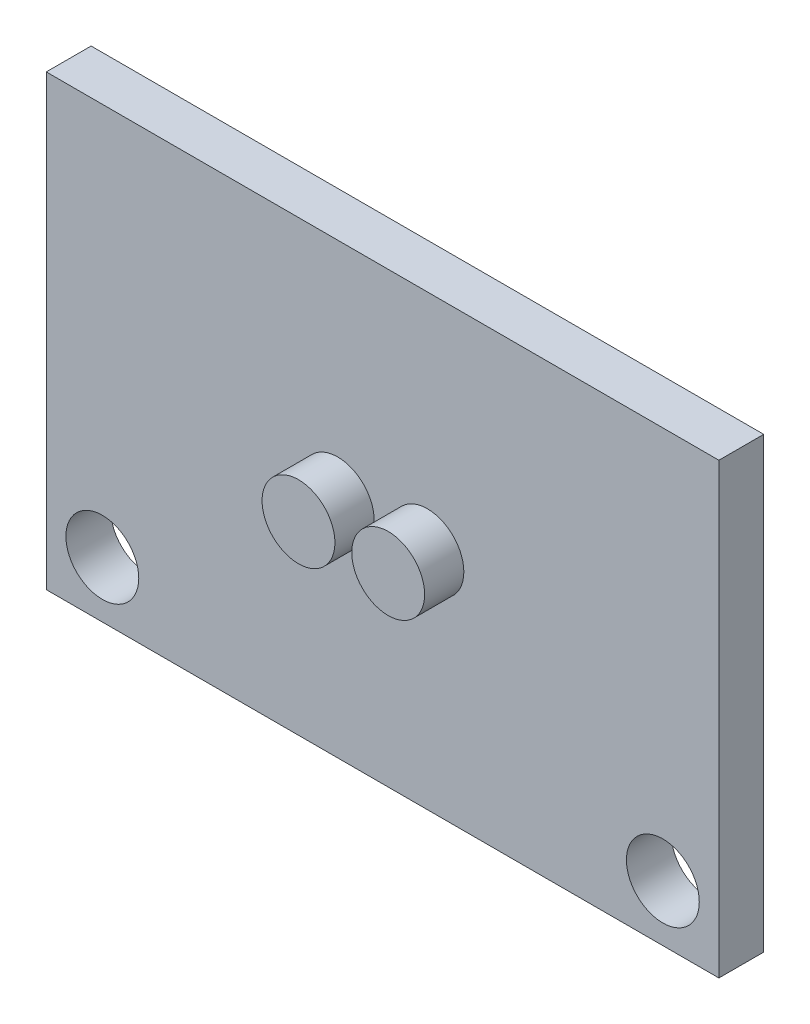
ISO-10303-21;
HEADER;
FILE_DESCRIPTION(('STEP AP214'),'2;1');
FILE_NAME('part.step','',(''),(''),'','','');
FILE_SCHEMA(('AUTOMOTIVE_DESIGN { 1 0 10303 214 1 1 1 1 }'));
ENDSEC;
DATA;
#1=APPLICATION_CONTEXT('core data for automotive mechanical design processes');
#2=APPLICATION_PROTOCOL_DEFINITION('international standard','automotive_design',2000,#1);
#3=PRODUCT_CONTEXT('',#1,'mechanical');
#4=PRODUCT('Part','Part','',(#3));
#5=PRODUCT_RELATED_PRODUCT_CATEGORY('part','',(#4));
#6=PRODUCT_DEFINITION_FORMATION('','',#4);
#7=PRODUCT_DEFINITION_CONTEXT('part definition',#1,'design');
#8=PRODUCT_DEFINITION('design','',#6,#7);
#9=PRODUCT_DEFINITION_SHAPE('','',#8);
#10=(LENGTH_UNIT() NAMED_UNIT(*) SI_UNIT(.MILLI.,.METRE.));
#11=(NAMED_UNIT(*) PLANE_ANGLE_UNIT() SI_UNIT($,.RADIAN.));
#12=(NAMED_UNIT(*) SI_UNIT($,.STERADIAN.) SOLID_ANGLE_UNIT());
#13=UNCERTAINTY_MEASURE_WITH_UNIT(LENGTH_MEASURE(1.E-05),#10,'distance_accuracy_value','');
#14=(GEOMETRIC_REPRESENTATION_CONTEXT(3) GLOBAL_UNCERTAINTY_ASSIGNED_CONTEXT((#13)) GLOBAL_UNIT_ASSIGNED_CONTEXT((#10,
#11,#12)) REPRESENTATION_CONTEXT('',''));
#15=CARTESIAN_POINT('',(0.,0.,0.));
#16=DIRECTION('',(0.,0.,1.));
#17=DIRECTION('',(1.,0.,0.));
#18=AXIS2_PLACEMENT_3D('',#15,#16,#17);
#19=CARTESIAN_POINT('',(-12.,80.,1.6));
#20=DIRECTION('',(1.,0.,0.));
#21=DIRECTION('',(0.,0.,-1.));
#22=AXIS2_PLACEMENT_3D('',#19,#20,#21);
#23=PLANE('',#22);
#24=DIRECTION('',(0.,-1.,0.));
#25=VECTOR('',#24,1.);
#26=CARTESIAN_POINT('',(-12.,80.,0.));
#27=LINE('',#26,#25);
#28=CARTESIAN_POINT('',(-12.,96.,0.));
#29=VERTEX_POINT('',#28);
#30=CARTESIAN_POINT('',(-12.,80.,0.));
#31=VERTEX_POINT('',#30);
#32=EDGE_CURVE('E108',#29,#31,#27,.T.);
#33=ORIENTED_EDGE('',*,*,#32,.T.);
#34=DIRECTION('',(0.,0.,-1.));
#35=VECTOR('',#34,1.);
#36=CARTESIAN_POINT('',(-12.,80.,1.6));
#37=LINE('',#36,#35);
#38=CARTESIAN_POINT('',(-12.,80.,1.6));
#39=VERTEX_POINT('',#38);
#40=EDGE_CURVE('E42',#39,#31,#37,.T.);
#41=ORIENTED_EDGE('',*,*,#40,.F.);
#42=DIRECTION('',(0.,-1.,0.));
#43=VECTOR('',#42,1.);
#44=CARTESIAN_POINT('',(-12.,80.,1.6));
#45=LINE('',#44,#43);
#46=CARTESIAN_POINT('',(-12.,96.,1.6));
#47=VERTEX_POINT('',#46);
#48=EDGE_CURVE('E93',#47,#39,#45,.T.);
#49=ORIENTED_EDGE('',*,*,#48,.F.);
#50=DIRECTION('',(0.,0.,-1.));
#51=VECTOR('',#50,1.);
#52=CARTESIAN_POINT('',(-12.,96.,1.6));
#53=LINE('',#52,#51);
#54=EDGE_CURVE('E104',#47,#29,#53,.T.);
#55=ORIENTED_EDGE('',*,*,#54,.T.);
#56=EDGE_LOOP('',(#33,#41,#49,#55));
#57=FACE_BOUND('',#56,.T.);
#58=ADVANCED_FACE('F41',(#57),#23,.F.);
#59=CARTESIAN_POINT('',(-12.,80.,1.6));
#60=DIRECTION('',(0.,1.,0.));
#61=DIRECTION('',(0.,0.,1.));
#62=AXIS2_PLACEMENT_3D('',#59,#60,#61);
#63=PLANE('',#62);
#64=DIRECTION('',(1.,0.,0.));
#65=VECTOR('',#64,1.);
#66=CARTESIAN_POINT('',(-12.,80.,0.));
#67=LINE('',#66,#65);
#68=CARTESIAN_POINT('',(12.,80.,0.));
#69=VERTEX_POINT('',#68);
#70=EDGE_CURVE('E99',#31,#69,#67,.T.);
#71=ORIENTED_EDGE('',*,*,#70,.T.);
#72=DIRECTION('',(0.,0.,-1.));
#73=VECTOR('',#72,1.);
#74=CARTESIAN_POINT('',(12.,80.,1.6));
#75=LINE('',#74,#73);
#76=CARTESIAN_POINT('',(12.,80.,1.6));
#77=VERTEX_POINT('',#76);
#78=EDGE_CURVE('E96',#77,#69,#75,.T.);
#79=ORIENTED_EDGE('',*,*,#78,.F.);
#80=DIRECTION('',(1.,0.,0.));
#81=VECTOR('',#80,1.);
#82=CARTESIAN_POINT('',(-12.,80.,1.6));
#83=LINE('',#82,#81);
#84=EDGE_CURVE('E89',#39,#77,#83,.T.);
#85=ORIENTED_EDGE('',*,*,#84,.F.);
#86=ORIENTED_EDGE('',*,*,#40,.T.);
#87=EDGE_LOOP('',(#71,#79,#85,#86));
#88=FACE_BOUND('',#87,.T.);
#89=ADVANCED_FACE('F100',(#88),#63,.F.);
#90=CARTESIAN_POINT('',(12.,80.,1.6));
#91=DIRECTION('',(-1.,0.,0.));
#92=DIRECTION('',(0.,0.,1.));
#93=AXIS2_PLACEMENT_3D('',#90,#91,#92);
#94=PLANE('',#93);
#95=DIRECTION('',(0.,1.,0.));
#96=VECTOR('',#95,1.);
#97=CARTESIAN_POINT('',(12.,80.,0.));
#98=LINE('',#97,#96);
#99=CARTESIAN_POINT('',(12.,96.,0.));
#100=VERTEX_POINT('',#99);
#101=EDGE_CURVE('E77',#69,#100,#98,.T.);
#102=ORIENTED_EDGE('',*,*,#101,.T.);
#103=DIRECTION('',(0.,0.,-1.));
#104=VECTOR('',#103,1.);
#105=CARTESIAN_POINT('',(12.,96.,1.6));
#106=LINE('',#105,#104);
#107=CARTESIAN_POINT('',(12.,96.,1.6));
#108=VERTEX_POINT('',#107);
#109=EDGE_CURVE('E103',#108,#100,#106,.T.);
#110=ORIENTED_EDGE('',*,*,#109,.F.);
#111=DIRECTION('',(0.,1.,0.));
#112=VECTOR('',#111,1.);
#113=CARTESIAN_POINT('',(12.,80.,1.6));
#114=LINE('',#113,#112);
#115=EDGE_CURVE('E94',#77,#108,#114,.T.);
#116=ORIENTED_EDGE('',*,*,#115,.F.);
#117=ORIENTED_EDGE('',*,*,#78,.T.);
#118=EDGE_LOOP('',(#102,#110,#116,#117));
#119=FACE_BOUND('',#118,.T.);
#120=ADVANCED_FACE('F105',(#119),#94,.F.);
#121=CARTESIAN_POINT('',(-12.,96.,1.6));
#122=DIRECTION('',(0.,-1.,0.));
#123=DIRECTION('',(0.,0.,-1.));
#124=AXIS2_PLACEMENT_3D('',#121,#122,#123);
#125=PLANE('',#124);
#126=DIRECTION('',(-1.,0.,0.));
#127=VECTOR('',#126,1.);
#128=CARTESIAN_POINT('',(-12.,96.,0.));
#129=LINE('',#128,#127);
#130=EDGE_CURVE('E85',#100,#29,#129,.T.);
#131=ORIENTED_EDGE('',*,*,#130,.T.);
#132=ORIENTED_EDGE('',*,*,#54,.F.);
#133=DIRECTION('',(-1.,0.,0.));
#134=VECTOR('',#133,1.);
#135=CARTESIAN_POINT('',(-12.,96.,1.6));
#136=LINE('',#135,#134);
#137=EDGE_CURVE('E56',#108,#47,#136,.T.);
#138=ORIENTED_EDGE('',*,*,#137,.F.);
#139=ORIENTED_EDGE('',*,*,#109,.T.);
#140=EDGE_LOOP('',(#131,#132,#138,#139));
#141=FACE_BOUND('',#140,.T.);
#142=ADVANCED_FACE('F116',(#141),#125,.F.);
#143=CARTESIAN_POINT('',(0.,0.,1.6));
#144=DIRECTION('',(0.,0.,-1.));
#145=DIRECTION('',(-1.,0.,0.));
#146=AXIS2_PLACEMENT_3D('',#143,#144,#145);
#147=PLANE('',#146);
#148=CARTESIAN_POINT('',(-10.,82.,1.6));
#149=DIRECTION('',(0.,0.,1.));
#150=DIRECTION('',(1.,0.,0.));
#151=AXIS2_PLACEMENT_3D('',#148,#149,#150);
#152=CIRCLE('',#151,1.3);
#153=CARTESIAN_POINT('',(-8.7,82.,1.6));
#154=VERTEX_POINT('',#153);
#155=EDGE_CURVE('E137',#154,#154,#152,.T.);
#156=ORIENTED_EDGE('',*,*,#155,.F.);
#157=EDGE_LOOP('',(#156));
#158=FACE_BOUND('',#157,.T.);
#159=CARTESIAN_POINT('',(10.,82.,1.6));
#160=DIRECTION('',(0.,0.,1.));
#161=DIRECTION('',(1.,0.,0.));
#162=AXIS2_PLACEMENT_3D('',#159,#160,#161);
#163=CIRCLE('',#162,1.3);
#164=CARTESIAN_POINT('',(11.3,82.,1.6));
#165=VERTEX_POINT('',#164);
#166=EDGE_CURVE('E132',#165,#165,#163,.T.);
#167=ORIENTED_EDGE('',*,*,#166,.F.);
#168=EDGE_LOOP('',(#167));
#169=FACE_BOUND('',#168,.T.);
#170=CARTESIAN_POINT('',(-1.6,88.,1.6));
#171=DIRECTION('',(0.,0.,1.));
#172=DIRECTION('',(1.,0.,0.));
#173=AXIS2_PLACEMENT_3D('',#170,#171,#172);
#174=CIRCLE('',#173,1.3);
#175=CARTESIAN_POINT('',(-0.3,88.,1.6));
#176=VERTEX_POINT('',#175);
#177=EDGE_CURVE('E11',#176,#176,#174,.T.);
#178=ORIENTED_EDGE('',*,*,#177,.F.);
#179=EDGE_LOOP('',(#178));
#180=FACE_BOUND('',#179,.T.);
#181=CARTESIAN_POINT('',(1.6,88.,1.6));
#182=DIRECTION('',(0.,0.,1.));
#183=DIRECTION('',(1.,0.,0.));
#184=AXIS2_PLACEMENT_3D('',#181,#182,#183);
#185=CIRCLE('',#184,1.3);
#186=CARTESIAN_POINT('',(2.9,88.,1.6));
#187=VERTEX_POINT('',#186);
#188=EDGE_CURVE('E49',#187,#187,#185,.T.);
#189=ORIENTED_EDGE('',*,*,#188,.F.);
#190=EDGE_LOOP('',(#189));
#191=FACE_BOUND('',#190,.T.);
#192=ORIENTED_EDGE('',*,*,#48,.T.);
#193=ORIENTED_EDGE('',*,*,#84,.T.);
#194=ORIENTED_EDGE('',*,*,#115,.T.);
#195=ORIENTED_EDGE('',*,*,#137,.T.);
#196=EDGE_LOOP('',(#192,#193,#194,#195));
#197=FACE_BOUND('',#196,.T.);
#198=ADVANCED_FACE('F92',(#158,#169,#180,#191,#197),#147,.F.);
#199=CARTESIAN_POINT('',(0.,0.,0.));
#200=DIRECTION('',(0.,0.,-1.));
#201=DIRECTION('',(-1.,0.,0.));
#202=AXIS2_PLACEMENT_3D('',#199,#200,#201);
#203=PLANE('',#202);
#204=CARTESIAN_POINT('',(-10.,82.,0.));
#205=DIRECTION('',(0.,0.,1.));
#206=DIRECTION('',(1.,0.,0.));
#207=AXIS2_PLACEMENT_3D('',#204,#205,#206);
#208=CIRCLE('',#207,1.3);
#209=CARTESIAN_POINT('',(-8.7,82.,0.));
#210=VERTEX_POINT('',#209);
#211=EDGE_CURVE('E123',#210,#210,#208,.T.);
#212=ORIENTED_EDGE('',*,*,#211,.T.);
#213=EDGE_LOOP('',(#212));
#214=FACE_BOUND('',#213,.T.);
#215=CARTESIAN_POINT('',(10.,82.,0.));
#216=DIRECTION('',(0.,0.,1.));
#217=DIRECTION('',(1.,0.,0.));
#218=AXIS2_PLACEMENT_3D('',#215,#216,#217);
#219=CIRCLE('',#218,1.3);
#220=CARTESIAN_POINT('',(11.3,82.,0.));
#221=VERTEX_POINT('',#220);
#222=EDGE_CURVE('E127',#221,#221,#219,.T.);
#223=ORIENTED_EDGE('',*,*,#222,.T.);
#224=EDGE_LOOP('',(#223));
#225=FACE_BOUND('',#224,.T.);
#226=ORIENTED_EDGE('',*,*,#32,.F.);
#227=ORIENTED_EDGE('',*,*,#130,.F.);
#228=ORIENTED_EDGE('',*,*,#101,.F.);
#229=ORIENTED_EDGE('',*,*,#70,.F.);
#230=EDGE_LOOP('',(#226,#227,#228,#229));
#231=FACE_BOUND('',#230,.T.);
#232=ADVANCED_FACE('F118',(#214,#225,#231),#203,.T.);
#233=CARTESIAN_POINT('',(1.6,88.,3.));
#234=DIRECTION('',(0.,0.,-1.));
#235=DIRECTION('',(-1.,0.,0.));
#236=AXIS2_PLACEMENT_3D('',#233,#234,#235);
#237=CYLINDRICAL_SURFACE('',#236,1.3);
#238=CARTESIAN_POINT('',(1.6,88.,3.));
#239=DIRECTION('',(0.,0.,1.));
#240=DIRECTION('',(1.,0.,0.));
#241=AXIS2_PLACEMENT_3D('',#238,#239,#240);
#242=CIRCLE('',#241,1.3);
#243=CARTESIAN_POINT('',(2.9,88.,3.));
#244=VERTEX_POINT('',#243);
#245=EDGE_CURVE('E125',#244,#244,#242,.T.);
#246=ORIENTED_EDGE('',*,*,#245,.F.);
#247=EDGE_LOOP('',(#246));
#248=FACE_BOUND('',#247,.T.);
#249=ORIENTED_EDGE('',*,*,#188,.T.);
#250=EDGE_LOOP('',(#249));
#251=FACE_BOUND('',#250,.T.);
#252=ADVANCED_FACE('F158',(#248,#251),#237,.T.);
#253=CARTESIAN_POINT('',(1.6,88.,3.));
#254=DIRECTION('',(0.,0.,1.));
#255=DIRECTION('',(1.,0.,0.));
#256=AXIS2_PLACEMENT_3D('',#253,#254,#255);
#257=PLANE('',#256);
#258=ORIENTED_EDGE('',*,*,#245,.T.);
#259=EDGE_LOOP('',(#258));
#260=FACE_BOUND('',#259,.T.);
#261=ADVANCED_FACE('F162',(#260),#257,.T.);
#262=CARTESIAN_POINT('',(-1.6,88.,3.));
#263=DIRECTION('',(0.,0.,-1.));
#264=DIRECTION('',(-1.,0.,0.));
#265=AXIS2_PLACEMENT_3D('',#262,#263,#264);
#266=CYLINDRICAL_SURFACE('',#265,1.3);
#267=CARTESIAN_POINT('',(-1.6,88.,3.));
#268=DIRECTION('',(0.,0.,1.));
#269=DIRECTION('',(1.,0.,0.));
#270=AXIS2_PLACEMENT_3D('',#267,#268,#269);
#271=CIRCLE('',#270,1.3);
#272=CARTESIAN_POINT('',(-0.3,88.,3.));
#273=VERTEX_POINT('',#272);
#274=EDGE_CURVE('E111',#273,#273,#271,.T.);
#275=ORIENTED_EDGE('',*,*,#274,.F.);
#276=EDGE_LOOP('',(#275));
#277=FACE_BOUND('',#276,.T.);
#278=ORIENTED_EDGE('',*,*,#177,.T.);
#279=EDGE_LOOP('',(#278));
#280=FACE_BOUND('',#279,.T.);
#281=ADVANCED_FACE('F169',(#277,#280),#266,.T.);
#282=CARTESIAN_POINT('',(-1.6,88.,3.));
#283=DIRECTION('',(0.,0.,1.));
#284=DIRECTION('',(1.,0.,0.));
#285=AXIS2_PLACEMENT_3D('',#282,#283,#284);
#286=PLANE('',#285);
#287=ORIENTED_EDGE('',*,*,#274,.T.);
#288=EDGE_LOOP('',(#287));
#289=FACE_BOUND('',#288,.T.);
#290=ADVANCED_FACE('F230',(#289),#286,.T.);
#291=CARTESIAN_POINT('',(10.,82.,0.));
#292=DIRECTION('',(0.,0.,1.));
#293=DIRECTION('',(1.,0.,0.));
#294=AXIS2_PLACEMENT_3D('',#291,#292,#293);
#295=CYLINDRICAL_SURFACE('',#294,1.3);
#296=ORIENTED_EDGE('',*,*,#222,.F.);
#297=EDGE_LOOP('',(#296));
#298=FACE_BOUND('',#297,.T.);
#299=ORIENTED_EDGE('',*,*,#166,.T.);
#300=EDGE_LOOP('',(#299));
#301=FACE_BOUND('',#300,.T.);
#302=ADVANCED_FACE('F150',(#298,#301),#295,.F.);
#303=CARTESIAN_POINT('',(-10.,82.,0.));
#304=DIRECTION('',(0.,0.,1.));
#305=DIRECTION('',(1.,0.,0.));
#306=AXIS2_PLACEMENT_3D('',#303,#304,#305);
#307=CYLINDRICAL_SURFACE('',#306,1.3);
#308=ORIENTED_EDGE('',*,*,#211,.F.);
#309=EDGE_LOOP('',(#308));
#310=FACE_BOUND('',#309,.T.);
#311=ORIENTED_EDGE('',*,*,#155,.T.);
#312=EDGE_LOOP('',(#311));
#313=FACE_BOUND('',#312,.T.);
#314=ADVANCED_FACE('F144',(#310,#313),#307,.F.);
#315=CLOSED_SHELL('',(#58,#89,#120,#142,#198,#232,#252,#261,#281,#290,#302,#314));
#316=MANIFOLD_SOLID_BREP('B2',#315);
#317=ADVANCED_BREP_SHAPE_REPRESENTATION('',(#18,#316),#14);
#318=SHAPE_DEFINITION_REPRESENTATION(#9,#317);
ENDSEC;
END-ISO-10303-21;
